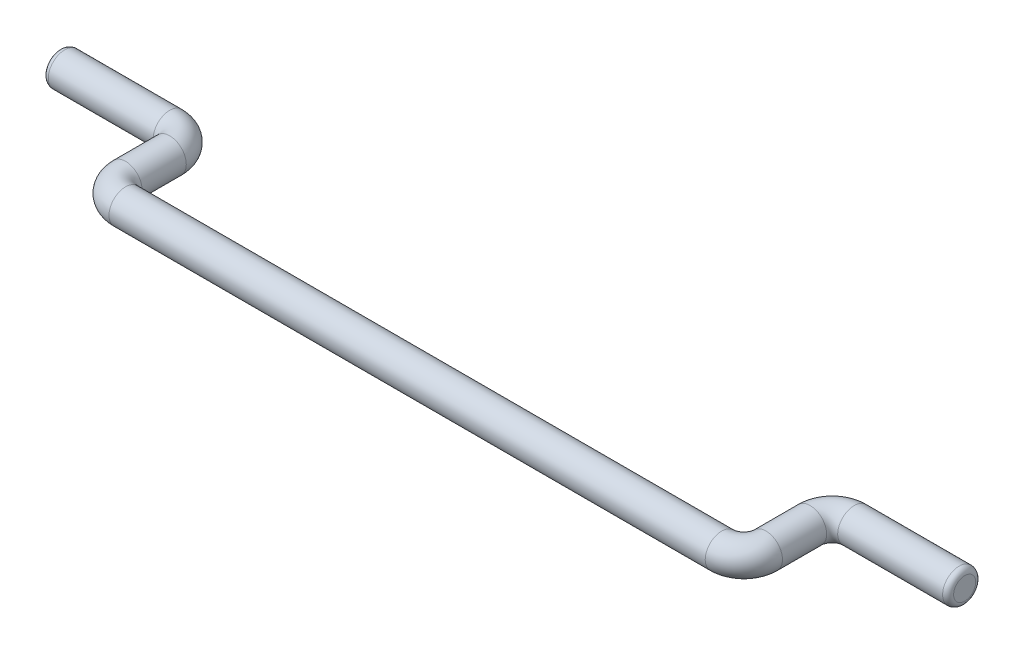
ISO-10303-21;
HEADER;
FILE_DESCRIPTION(('STEP AP214'),'2;1');
FILE_NAME('part.step','',(''),(''),'','','');
FILE_SCHEMA(('AUTOMOTIVE_DESIGN { 1 0 10303 214 1 1 1 1 }'));
ENDSEC;
DATA;
#1=APPLICATION_CONTEXT('core data for automotive mechanical design processes');
#2=APPLICATION_PROTOCOL_DEFINITION('international standard','automotive_design',2000,#1);
#3=PRODUCT_CONTEXT('',#1,'mechanical');
#4=PRODUCT('Part','Part','',(#3));
#5=PRODUCT_RELATED_PRODUCT_CATEGORY('part','',(#4));
#6=PRODUCT_DEFINITION_FORMATION('','',#4);
#7=PRODUCT_DEFINITION_CONTEXT('part definition',#1,'design');
#8=PRODUCT_DEFINITION('design','',#6,#7);
#9=PRODUCT_DEFINITION_SHAPE('','',#8);
#10=(LENGTH_UNIT() NAMED_UNIT(*) SI_UNIT(.MILLI.,.METRE.));
#11=(NAMED_UNIT(*) PLANE_ANGLE_UNIT() SI_UNIT($,.RADIAN.));
#12=(NAMED_UNIT(*) SI_UNIT($,.STERADIAN.) SOLID_ANGLE_UNIT());
#13=UNCERTAINTY_MEASURE_WITH_UNIT(LENGTH_MEASURE(1.E-05),#10,'distance_accuracy_value','');
#14=(GEOMETRIC_REPRESENTATION_CONTEXT(3) GLOBAL_UNCERTAINTY_ASSIGNED_CONTEXT((#13)) GLOBAL_UNIT_ASSIGNED_CONTEXT((#10,
#11,#12)) REPRESENTATION_CONTEXT('',''));
#15=CARTESIAN_POINT('',(0.,0.,0.));
#16=DIRECTION('',(0.,0.,1.));
#17=DIRECTION('',(1.,0.,0.));
#18=AXIS2_PLACEMENT_3D('',#15,#16,#17);
#19=CARTESIAN_POINT('',(-6.,0.,0.));
#20=DIRECTION('',(1.,0.,0.));
#21=DIRECTION('',(0.,0.,-1.));
#22=AXIS2_PLACEMENT_3D('',#19,#20,#21);
#23=PLANE('',#22);
#24=CARTESIAN_POINT('',(-6.,0.,0.));
#25=DIRECTION('',(1.,0.,0.));
#26=DIRECTION('',(0.,0.,-1.));
#27=AXIS2_PLACEMENT_3D('',#24,#25,#26);
#28=CIRCLE('',#27,0.5);
#29=CARTESIAN_POINT('',(-6.,0.,-0.5));
#30=VERTEX_POINT('',#29);
#31=EDGE_CURVE('E10',#30,#30,#28,.F.);
#32=ORIENTED_EDGE('',*,*,#31,.T.);
#33=EDGE_LOOP('',(#32));
#34=FACE_BOUND('',#33,.T.);
#35=ADVANCED_FACE('F45',(#34),#23,.F.);
#36=CARTESIAN_POINT('',(35.,0.,0.));
#37=DIRECTION('',(1.,0.,0.));
#38=DIRECTION('',(0.,0.,-1.));
#39=AXIS2_PLACEMENT_3D('',#36,#37,#38);
#40=PLANE('',#39);
#41=CARTESIAN_POINT('',(35.,0.,0.));
#42=DIRECTION('',(1.,0.,0.));
#43=DIRECTION('',(0.,0.,-1.));
#44=AXIS2_PLACEMENT_3D('',#41,#42,#43);
#45=CIRCLE('',#44,0.5);
#46=CARTESIAN_POINT('',(35.,0.,-0.5));
#47=VERTEX_POINT('',#46);
#48=EDGE_CURVE('E63',#47,#47,#45,.T.);
#49=ORIENTED_EDGE('',*,*,#48,.T.);
#50=EDGE_LOOP('',(#49));
#51=FACE_BOUND('',#50,.T.);
#52=ADVANCED_FACE('F106',(#51),#40,.T.);
#53=CARTESIAN_POINT('',(-6.,0.,0.));
#54=DIRECTION('',(1.,0.,0.));
#55=DIRECTION('',(0.,0.,-1.));
#56=AXIS2_PLACEMENT_3D('',#53,#54,#55);
#57=CYLINDRICAL_SURFACE('',#56,0.75);
#58=CARTESIAN_POINT('',(-5.75,0.,0.));
#59=DIRECTION('',(1.,0.,0.));
#60=DIRECTION('',(0.,0.,-1.));
#61=AXIS2_PLACEMENT_3D('',#58,#59,#60);
#62=CIRCLE('',#61,0.75);
#63=CARTESIAN_POINT('',(-5.75,0.,-0.75));
#64=VERTEX_POINT('',#63);
#65=EDGE_CURVE('E53',#64,#64,#62,.T.);
#66=ORIENTED_EDGE('',*,*,#65,.T.);
#67=EDGE_LOOP('',(#66));
#68=FACE_BOUND('',#67,.T.);
#69=CARTESIAN_POINT('',(-1.00000000000001,0.,0.));
#70=DIRECTION('',(1.,0.,0.));
#71=DIRECTION('',(0.,0.,-1.));
#72=AXIS2_PLACEMENT_3D('',#69,#70,#71);
#73=CIRCLE('',#72,0.75);
#74=CARTESIAN_POINT('',(-1.00000000000001,0.,-0.750000000000043));
#75=VERTEX_POINT('',#74);
#76=EDGE_CURVE('E97',#75,#75,#73,.T.);
#77=ORIENTED_EDGE('',*,*,#76,.F.);
#78=EDGE_LOOP('',(#77));
#79=FACE_BOUND('',#78,.T.);
#80=ADVANCED_FACE('F104',(#68,#79),#57,.T.);
#81=CARTESIAN_POINT('',(-1.,0.,1.));
#82=DIRECTION('',(0.,-1.,0.));
#83=DIRECTION('',(0.,0.,-1.));
#84=AXIS2_PLACEMENT_3D('',#81,#82,#83);
#85=TOROIDAL_SURFACE('',#84,1.00000000000004,0.75);
#86=CARTESIAN_POINT('',(0.,0.,1.00000000000001));
#87=DIRECTION('',(0.,0.,1.));
#88=DIRECTION('',(1.,0.,0.));
#89=AXIS2_PLACEMENT_3D('',#86,#87,#88);
#90=CIRCLE('',#89,0.75);
#91=CARTESIAN_POINT('',(0.750000000000043,0.,1.00000000000001));
#92=VERTEX_POINT('',#91);
#93=EDGE_CURVE('E93',#92,#92,#90,.T.);
#94=CARTESIAN_POINT('',(-1.,0.,1.));
#95=DIRECTION('',(0.,-1.,0.));
#96=DIRECTION('',(0.,0.,-1.));
#97=AXIS2_PLACEMENT_3D('',#94,#95,#96);
#98=CIRCLE('',#97,1.75000000000004);
#99=EDGE_CURVE('',#75,#92,#98,.T.);
#100=ORIENTED_EDGE('',*,*,#76,.T.);
#101=ORIENTED_EDGE('',*,*,#93,.F.);
#102=ORIENTED_EDGE('',*,*,#99,.T.);
#103=ORIENTED_EDGE('',*,*,#99,.F.);
#104=EDGE_LOOP('',(#100,#102,#101,#103));
#105=FACE_BOUND('',#104,.T.);
#106=ADVANCED_FACE('F102',(#105),#85,.T.);
#107=CARTESIAN_POINT('',(0.,0.,1.00000000000001));
#108=DIRECTION('',(0.,0.,1.));
#109=DIRECTION('',(1.,0.,0.));
#110=AXIS2_PLACEMENT_3D('',#107,#108,#109);
#111=CYLINDRICAL_SURFACE('',#110,0.75);
#112=CARTESIAN_POINT('',(0.,0.,2.99999999999999));
#113=DIRECTION('',(0.,0.,1.));
#114=DIRECTION('',(1.,0.,0.));
#115=AXIS2_PLACEMENT_3D('',#112,#113,#114);
#116=CIRCLE('',#115,0.75);
#117=CARTESIAN_POINT('',(-0.75,0.,2.99999999999999));
#118=VERTEX_POINT('',#117);
#119=EDGE_CURVE('E89',#118,#118,#116,.T.);
#120=ORIENTED_EDGE('',*,*,#119,.F.);
#121=EDGE_LOOP('',(#120));
#122=FACE_BOUND('',#121,.T.);
#123=ORIENTED_EDGE('',*,*,#93,.T.);
#124=EDGE_LOOP('',(#123));
#125=FACE_BOUND('',#124,.T.);
#126=ADVANCED_FACE('F113',(#122,#125),#111,.T.);
#127=CARTESIAN_POINT('',(1.,0.,3.));
#128=DIRECTION('',(0.,1.,0.));
#129=DIRECTION('',(0.,0.,1.));
#130=AXIS2_PLACEMENT_3D('',#127,#128,#129);
#131=TOROIDAL_SURFACE('',#130,1.,0.75);
#132=CARTESIAN_POINT('',(1.,0.,4.));
#133=DIRECTION('',(1.,0.,0.));
#134=DIRECTION('',(0.,0.,-1.));
#135=AXIS2_PLACEMENT_3D('',#132,#133,#134);
#136=CIRCLE('',#135,0.75);
#137=CARTESIAN_POINT('',(1.,0.,4.75));
#138=VERTEX_POINT('',#137);
#139=EDGE_CURVE('E85',#138,#138,#136,.T.);
#140=CARTESIAN_POINT('',(1.,0.,3.));
#141=DIRECTION('',(0.,1.,0.));
#142=DIRECTION('',(0.,0.,1.));
#143=AXIS2_PLACEMENT_3D('',#140,#141,#142);
#144=CIRCLE('',#143,1.75);
#145=EDGE_CURVE('',#118,#138,#144,.T.);
#146=ORIENTED_EDGE('',*,*,#119,.T.);
#147=ORIENTED_EDGE('',*,*,#139,.F.);
#148=ORIENTED_EDGE('',*,*,#145,.T.);
#149=ORIENTED_EDGE('',*,*,#145,.F.);
#150=EDGE_LOOP('',(#146,#148,#147,#149));
#151=FACE_BOUND('',#150,.T.);
#152=ADVANCED_FACE('F165',(#151),#131,.T.);
#153=CARTESIAN_POINT('',(1.,0.,4.));
#154=DIRECTION('',(1.,0.,0.));
#155=DIRECTION('',(0.,0.,-1.));
#156=AXIS2_PLACEMENT_3D('',#153,#154,#155);
#157=CYLINDRICAL_SURFACE('',#156,0.75);
#158=CARTESIAN_POINT('',(28.,0.,3.99999999999999));
#159=DIRECTION('',(1.,0.,0.));
#160=DIRECTION('',(0.,0.,-1.));
#161=AXIS2_PLACEMENT_3D('',#158,#159,#160);
#162=CIRCLE('',#161,0.75);
#163=CARTESIAN_POINT('',(28.,0.,4.75000000000003));
#164=VERTEX_POINT('',#163);
#165=EDGE_CURVE('E81',#164,#164,#162,.T.);
#166=ORIENTED_EDGE('',*,*,#165,.F.);
#167=EDGE_LOOP('',(#166));
#168=FACE_BOUND('',#167,.T.);
#169=ORIENTED_EDGE('',*,*,#139,.T.);
#170=EDGE_LOOP('',(#169));
#171=FACE_BOUND('',#170,.T.);
#172=ADVANCED_FACE('F175',(#168,#171),#157,.T.);
#173=CARTESIAN_POINT('',(28.,0.,2.99999999999999));
#174=DIRECTION('',(0.,1.,0.));
#175=DIRECTION('',(0.,0.,1.));
#176=AXIS2_PLACEMENT_3D('',#173,#174,#175);
#177=TOROIDAL_SURFACE('',#176,1.00000000000004,0.75);
#178=CARTESIAN_POINT('',(29.,0.,2.99999999999998));
#179=DIRECTION('',(0.,0.,-1.));
#180=DIRECTION('',(-1.,0.,0.));
#181=AXIS2_PLACEMENT_3D('',#178,#179,#180);
#182=CIRCLE('',#181,0.75);
#183=CARTESIAN_POINT('',(29.75,0.,2.99999999999998));
#184=VERTEX_POINT('',#183);
#185=EDGE_CURVE('E77',#184,#184,#182,.T.);
#186=CARTESIAN_POINT('',(28.,0.,2.99999999999999));
#187=DIRECTION('',(0.,1.,0.));
#188=DIRECTION('',(0.,0.,1.));
#189=AXIS2_PLACEMENT_3D('',#186,#187,#188);
#190=CIRCLE('',#189,1.75000000000004);
#191=EDGE_CURVE('',#164,#184,#190,.T.);
#192=ORIENTED_EDGE('',*,*,#165,.T.);
#193=ORIENTED_EDGE('',*,*,#185,.F.);
#194=ORIENTED_EDGE('',*,*,#191,.T.);
#195=ORIENTED_EDGE('',*,*,#191,.F.);
#196=EDGE_LOOP('',(#192,#194,#193,#195));
#197=FACE_BOUND('',#196,.T.);
#198=ADVANCED_FACE('F185',(#197),#177,.T.);
#199=CARTESIAN_POINT('',(29.,0.,2.99999999999998));
#200=DIRECTION('',(0.,0.,-1.));
#201=DIRECTION('',(-1.,0.,0.));
#202=AXIS2_PLACEMENT_3D('',#199,#200,#201);
#203=CYLINDRICAL_SURFACE('',#202,0.75);
#204=CARTESIAN_POINT('',(29.,0.,1.00000000000001));
#205=DIRECTION('',(0.,0.,-1.));
#206=DIRECTION('',(-1.,0.,0.));
#207=AXIS2_PLACEMENT_3D('',#204,#205,#206);
#208=CIRCLE('',#207,0.75);
#209=CARTESIAN_POINT('',(28.25,0.,1.00000000000001));
#210=VERTEX_POINT('',#209);
#211=EDGE_CURVE('E73',#210,#210,#208,.T.);
#212=ORIENTED_EDGE('',*,*,#211,.F.);
#213=EDGE_LOOP('',(#212));
#214=FACE_BOUND('',#213,.T.);
#215=ORIENTED_EDGE('',*,*,#185,.T.);
#216=EDGE_LOOP('',(#215));
#217=FACE_BOUND('',#216,.T.);
#218=ADVANCED_FACE('F128',(#214,#217),#203,.T.);
#219=CARTESIAN_POINT('',(30.,0.,1.));
#220=DIRECTION('',(0.,-1.,0.));
#221=DIRECTION('',(0.,0.,-1.));
#222=AXIS2_PLACEMENT_3D('',#219,#220,#221);
#223=TOROIDAL_SURFACE('',#222,1.,0.75);
#224=CARTESIAN_POINT('',(30.,0.,0.));
#225=DIRECTION('',(1.,0.,0.));
#226=DIRECTION('',(0.,0.,-1.));
#227=AXIS2_PLACEMENT_3D('',#224,#225,#226);
#228=CIRCLE('',#227,0.75);
#229=CARTESIAN_POINT('',(30.,0.,-0.750000000000001));
#230=VERTEX_POINT('',#229);
#231=EDGE_CURVE('E69',#230,#230,#228,.T.);
#232=CARTESIAN_POINT('',(30.,0.,1.));
#233=DIRECTION('',(0.,-1.,0.));
#234=DIRECTION('',(0.,0.,-1.));
#235=AXIS2_PLACEMENT_3D('',#232,#233,#234);
#236=CIRCLE('',#235,1.75);
#237=EDGE_CURVE('',#210,#230,#236,.T.);
#238=ORIENTED_EDGE('',*,*,#211,.T.);
#239=ORIENTED_EDGE('',*,*,#231,.F.);
#240=ORIENTED_EDGE('',*,*,#237,.T.);
#241=ORIENTED_EDGE('',*,*,#237,.F.);
#242=EDGE_LOOP('',(#238,#240,#239,#241));
#243=FACE_BOUND('',#242,.T.);
#244=ADVANCED_FACE('F120',(#243),#223,.T.);
#245=CARTESIAN_POINT('',(30.,0.,0.));
#246=DIRECTION('',(1.,0.,0.));
#247=DIRECTION('',(0.,0.,-1.));
#248=AXIS2_PLACEMENT_3D('',#245,#246,#247);
#249=CYLINDRICAL_SURFACE('',#248,0.75);
#250=CARTESIAN_POINT('',(34.75,0.,0.));
#251=DIRECTION('',(1.,0.,0.));
#252=DIRECTION('',(0.,0.,-1.));
#253=AXIS2_PLACEMENT_3D('',#250,#251,#252);
#254=CIRCLE('',#253,0.75);
#255=CARTESIAN_POINT('',(34.75,0.,-0.75));
#256=VERTEX_POINT('',#255);
#257=EDGE_CURVE('E58',#256,#256,#254,.F.);
#258=ORIENTED_EDGE('',*,*,#257,.T.);
#259=EDGE_LOOP('',(#258));
#260=FACE_BOUND('',#259,.T.);
#261=ORIENTED_EDGE('',*,*,#231,.T.);
#262=EDGE_LOOP('',(#261));
#263=FACE_BOUND('',#262,.T.);
#264=ADVANCED_FACE('F118',(#260,#263),#249,.T.);
#265=CARTESIAN_POINT('',(34.75,0.,0.));
#266=DIRECTION('',(1.,0.,0.));
#267=DIRECTION('',(0.,0.,-1.));
#268=AXIS2_PLACEMENT_3D('',#265,#266,#267);
#269=TOROIDAL_SURFACE('',#268,0.5,0.25);
#270=ORIENTED_EDGE('',*,*,#257,.F.);
#271=EDGE_LOOP('',(#270));
#272=FACE_BOUND('',#271,.T.);
#273=ORIENTED_EDGE('',*,*,#48,.F.);
#274=EDGE_LOOP('',(#273));
#275=FACE_BOUND('',#274,.T.);
#276=ADVANCED_FACE('F119',(#272,#275),#269,.T.);
#277=CARTESIAN_POINT('',(-5.75,0.,0.));
#278=DIRECTION('',(1.,0.,0.));
#279=DIRECTION('',(0.,0.,-1.));
#280=AXIS2_PLACEMENT_3D('',#277,#278,#279);
#281=TOROIDAL_SURFACE('',#280,0.5,0.25);
#282=ORIENTED_EDGE('',*,*,#31,.F.);
#283=EDGE_LOOP('',(#282));
#284=FACE_BOUND('',#283,.T.);
#285=ORIENTED_EDGE('',*,*,#65,.F.);
#286=EDGE_LOOP('',(#285));
#287=FACE_BOUND('',#286,.T.);
#288=ADVANCED_FACE('F47',(#284,#287),#281,.T.);
#289=CLOSED_SHELL('',(#35,#52,#80,#106,#126,#152,#172,#198,#218,#244,#264,#276,#288));
#290=MANIFOLD_SOLID_BREP('B2',#289);
#291=ADVANCED_BREP_SHAPE_REPRESENTATION('',(#18,#290),#14);
#292=SHAPE_DEFINITION_REPRESENTATION(#9,#291);
ENDSEC;
END-ISO-10303-21;
